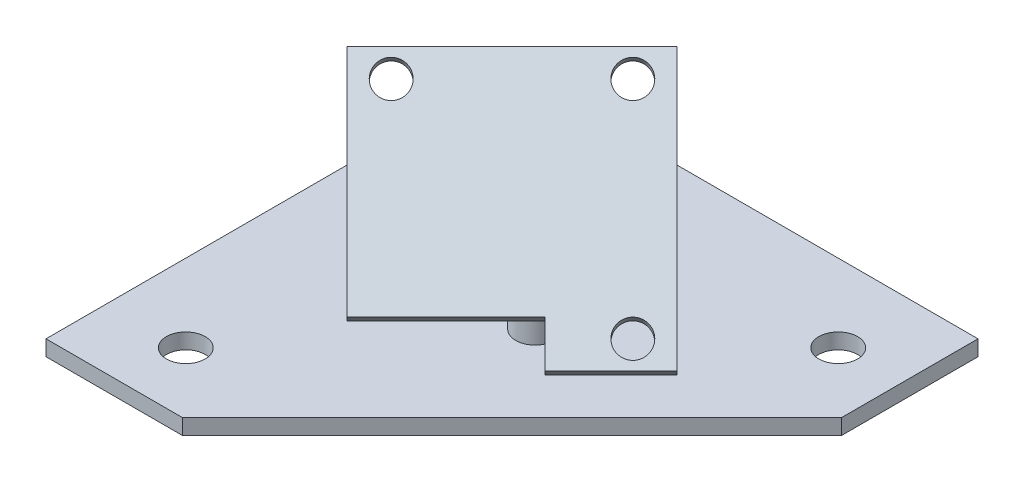
ISO-10303-21;
HEADER;
FILE_DESCRIPTION(('STEP AP214'),'2;1');
FILE_NAME('part.step','',(''),(''),'','','');
FILE_SCHEMA(('AUTOMOTIVE_DESIGN { 1 0 10303 214 1 1 1 1 }'));
ENDSEC;
DATA;
#1=APPLICATION_CONTEXT('core data for automotive mechanical design processes');
#2=APPLICATION_PROTOCOL_DEFINITION('international standard','automotive_design',2000,#1);
#3=PRODUCT_CONTEXT('',#1,'mechanical');
#4=PRODUCT('Part','Part','',(#3));
#5=PRODUCT_RELATED_PRODUCT_CATEGORY('part','',(#4));
#6=PRODUCT_DEFINITION_FORMATION('','',#4);
#7=PRODUCT_DEFINITION_CONTEXT('part definition',#1,'design');
#8=PRODUCT_DEFINITION('design','',#6,#7);
#9=PRODUCT_DEFINITION_SHAPE('','',#8);
#10=(LENGTH_UNIT() NAMED_UNIT(*) SI_UNIT(.MILLI.,.METRE.));
#11=(NAMED_UNIT(*) PLANE_ANGLE_UNIT() SI_UNIT($,.RADIAN.));
#12=(NAMED_UNIT(*) SI_UNIT($,.STERADIAN.) SOLID_ANGLE_UNIT());
#13=UNCERTAINTY_MEASURE_WITH_UNIT(LENGTH_MEASURE(1.E-05),#10,'distance_accuracy_value','');
#14=(GEOMETRIC_REPRESENTATION_CONTEXT(3) GLOBAL_UNCERTAINTY_ASSIGNED_CONTEXT((#13)) GLOBAL_UNIT_ASSIGNED_CONTEXT((#10,
#11,#12)) REPRESENTATION_CONTEXT('',''));
#15=CARTESIAN_POINT('',(0.,0.,0.));
#16=DIRECTION('',(0.,0.,1.));
#17=DIRECTION('',(1.,0.,0.));
#18=AXIS2_PLACEMENT_3D('',#15,#16,#17);
#19=CARTESIAN_POINT('',(0.,2.,0.));
#20=DIRECTION('',(0.,0.,-1.));
#21=DIRECTION('',(-1.,0.,0.));
#22=AXIS2_PLACEMENT_3D('',#19,#20,#21);
#23=PLANE('',#22);
#24=DIRECTION('',(1.,0.,0.));
#25=VECTOR('',#24,1.);
#26=CARTESIAN_POINT('',(0.,0.,0.));
#27=LINE('',#26,#25);
#28=CARTESIAN_POINT('',(20.,0.,0.));
#29=VERTEX_POINT('',#28);
#30=CARTESIAN_POINT('',(60.,0.,0.));
#31=VERTEX_POINT('',#30);
#32=EDGE_CURVE('E135',#29,#31,#27,.T.);
#33=ORIENTED_EDGE('',*,*,#32,.F.);
#34=DIRECTION('',(0.,-1.,0.));
#35=VECTOR('',#34,1.);
#36=CARTESIAN_POINT('',(20.,2.,0.));
#37=LINE('',#36,#35);
#38=CARTESIAN_POINT('',(20.,2.,0.));
#39=VERTEX_POINT('',#38);
#40=EDGE_CURVE('E11',#39,#29,#37,.T.);
#41=ORIENTED_EDGE('',*,*,#40,.F.);
#42=DIRECTION('',(1.,0.,0.));
#43=VECTOR('',#42,1.);
#44=CARTESIAN_POINT('',(0.,2.,0.));
#45=LINE('',#44,#43);
#46=CARTESIAN_POINT('',(60.,2.,0.));
#47=VERTEX_POINT('',#46);
#48=EDGE_CURVE('E173',#39,#47,#45,.T.);
#49=ORIENTED_EDGE('',*,*,#48,.T.);
#50=DIRECTION('',(0.,-1.,0.));
#51=VECTOR('',#50,1.);
#52=CARTESIAN_POINT('',(60.,2.,0.));
#53=LINE('',#52,#51);
#54=EDGE_CURVE('E52',#47,#31,#53,.T.);
#55=ORIENTED_EDGE('',*,*,#54,.T.);
#56=EDGE_LOOP('',(#33,#41,#49,#55));
#57=FACE_BOUND('',#56,.T.);
#58=ADVANCED_FACE('F35',(#57),#23,.T.);
#59=CARTESIAN_POINT('',(20.,2.,0.));
#60=DIRECTION('',(1.,0.,0.));
#61=DIRECTION('',(0.,0.,-1.));
#62=AXIS2_PLACEMENT_3D('',#59,#60,#61);
#63=PLANE('',#62);
#64=DIRECTION('',(0.,0.,1.));
#65=VECTOR('',#64,1.);
#66=CARTESIAN_POINT('',(20.,0.,0.));
#67=LINE('',#66,#65);
#68=CARTESIAN_POINT('',(20.,0.,20.));
#69=VERTEX_POINT('',#68);
#70=EDGE_CURVE('E137',#29,#69,#67,.T.);
#71=ORIENTED_EDGE('',*,*,#70,.T.);
#72=DIRECTION('',(0.,-1.,0.));
#73=VECTOR('',#72,1.);
#74=CARTESIAN_POINT('',(20.,2.,20.));
#75=LINE('',#74,#73);
#76=CARTESIAN_POINT('',(20.,2.,20.));
#77=VERTEX_POINT('',#76);
#78=EDGE_CURVE('E44',#77,#69,#75,.T.);
#79=ORIENTED_EDGE('',*,*,#78,.F.);
#80=DIRECTION('',(0.,0.,1.));
#81=VECTOR('',#80,1.);
#82=CARTESIAN_POINT('',(20.,2.,0.));
#83=LINE('',#82,#81);
#84=EDGE_CURVE('E171',#39,#77,#83,.T.);
#85=ORIENTED_EDGE('',*,*,#84,.F.);
#86=ORIENTED_EDGE('',*,*,#40,.T.);
#87=EDGE_LOOP('',(#71,#79,#85,#86));
#88=FACE_BOUND('',#87,.T.);
#89=ADVANCED_FACE('F165',(#88),#63,.F.);
#90=CARTESIAN_POINT('',(0.,2.,20.));
#91=DIRECTION('',(0.,0.,-1.));
#92=DIRECTION('',(-1.,0.,0.));
#93=AXIS2_PLACEMENT_3D('',#90,#91,#92);
#94=PLANE('',#93);
#95=DIRECTION('',(1.,0.,0.));
#96=VECTOR('',#95,1.);
#97=CARTESIAN_POINT('',(0.,0.,20.));
#98=LINE('',#97,#96);
#99=CARTESIAN_POINT('',(0.,0.,20.));
#100=VERTEX_POINT('',#99);
#101=EDGE_CURVE('E140',#100,#69,#98,.T.);
#102=ORIENTED_EDGE('',*,*,#101,.F.);
#103=DIRECTION('',(0.,-1.,0.));
#104=VECTOR('',#103,1.);
#105=CARTESIAN_POINT('',(0.,2.,20.));
#106=LINE('',#105,#104);
#107=CARTESIAN_POINT('',(0.,2.,20.));
#108=VERTEX_POINT('',#107);
#109=EDGE_CURVE('E156',#108,#100,#106,.T.);
#110=ORIENTED_EDGE('',*,*,#109,.F.);
#111=DIRECTION('',(1.,0.,0.));
#112=VECTOR('',#111,1.);
#113=CARTESIAN_POINT('',(0.,2.,20.));
#114=LINE('',#113,#112);
#115=EDGE_CURVE('E162',#108,#77,#114,.T.);
#116=ORIENTED_EDGE('',*,*,#115,.T.);
#117=ORIENTED_EDGE('',*,*,#78,.T.);
#118=EDGE_LOOP('',(#102,#110,#116,#117));
#119=FACE_BOUND('',#118,.T.);
#120=ADVANCED_FACE('F161',(#119),#94,.T.);
#121=CARTESIAN_POINT('',(0.,2.,0.));
#122=DIRECTION('',(1.,0.,0.));
#123=DIRECTION('',(0.,0.,-1.));
#124=AXIS2_PLACEMENT_3D('',#121,#122,#123);
#125=PLANE('',#124);
#126=DIRECTION('',(0.,0.,1.));
#127=VECTOR('',#126,1.);
#128=CARTESIAN_POINT('',(0.,0.,0.));
#129=LINE('',#128,#127);
#130=CARTESIAN_POINT('',(0.,0.,60.));
#131=VERTEX_POINT('',#130);
#132=EDGE_CURVE('E143',#100,#131,#129,.T.);
#133=ORIENTED_EDGE('',*,*,#132,.T.);
#134=DIRECTION('',(0.,-1.,0.));
#135=VECTOR('',#134,1.);
#136=CARTESIAN_POINT('',(0.,2.,60.));
#137=LINE('',#136,#135);
#138=CARTESIAN_POINT('',(0.,2.,60.));
#139=VERTEX_POINT('',#138);
#140=EDGE_CURVE('E120',#139,#131,#137,.T.);
#141=ORIENTED_EDGE('',*,*,#140,.F.);
#142=DIRECTION('',(0.,0.,1.));
#143=VECTOR('',#142,1.);
#144=CARTESIAN_POINT('',(0.,2.,0.));
#145=LINE('',#144,#143);
#146=EDGE_CURVE('E109',#108,#139,#145,.T.);
#147=ORIENTED_EDGE('',*,*,#146,.F.);
#148=ORIENTED_EDGE('',*,*,#109,.T.);
#149=EDGE_LOOP('',(#133,#141,#147,#148));
#150=FACE_BOUND('',#149,.T.);
#151=ADVANCED_FACE('F170',(#150),#125,.F.);
#152=CARTESIAN_POINT('',(0.,2.,60.));
#153=DIRECTION('',(0.,0.,-1.));
#154=DIRECTION('',(-1.,0.,0.));
#155=AXIS2_PLACEMENT_3D('',#152,#153,#154);
#156=PLANE('',#155);
#157=DIRECTION('',(1.,0.,0.));
#158=VECTOR('',#157,1.);
#159=CARTESIAN_POINT('',(0.,0.,60.));
#160=LINE('',#159,#158);
#161=CARTESIAN_POINT('',(17.5735931288071,0.,60.));
#162=VERTEX_POINT('',#161);
#163=EDGE_CURVE('E117',#131,#162,#160,.T.);
#164=ORIENTED_EDGE('',*,*,#163,.T.);
#165=DIRECTION('',(0.,-1.,0.));
#166=VECTOR('',#165,1.);
#167=CARTESIAN_POINT('',(17.5735931288071,2.,60.));
#168=LINE('',#167,#166);
#169=CARTESIAN_POINT('',(17.5735931288071,2.,60.));
#170=VERTEX_POINT('',#169);
#171=EDGE_CURVE('E115',#170,#162,#168,.T.);
#172=ORIENTED_EDGE('',*,*,#171,.F.);
#173=DIRECTION('',(1.,0.,0.));
#174=VECTOR('',#173,1.);
#175=CARTESIAN_POINT('',(0.,2.,60.));
#176=LINE('',#175,#174);
#177=EDGE_CURVE('E100',#139,#170,#176,.T.);
#178=ORIENTED_EDGE('',*,*,#177,.F.);
#179=ORIENTED_EDGE('',*,*,#140,.T.);
#180=EDGE_LOOP('',(#164,#172,#178,#179));
#181=FACE_BOUND('',#180,.T.);
#182=ADVANCED_FACE('F116',(#181),#156,.F.);
#183=CARTESIAN_POINT('',(38.7867965644036,2.,38.7867965644036));
#184=DIRECTION('',(0.707106781186547,0.,0.707106781186547));
#185=DIRECTION('',(0.707106781186548,0.,-0.707106781186548));
#186=AXIS2_PLACEMENT_3D('',#183,#184,#185);
#187=PLANE('',#186);
#188=DIRECTION('',(-0.707106781186548,0.,0.707106781186548));
#189=VECTOR('',#188,1.);
#190=CARTESIAN_POINT('',(38.7867965644036,0.,38.7867965644036));
#191=LINE('',#190,#189);
#192=CARTESIAN_POINT('',(60.,0.,17.5735931288071));
#193=VERTEX_POINT('',#192);
#194=EDGE_CURVE('E147',#193,#162,#191,.T.);
#195=ORIENTED_EDGE('',*,*,#194,.F.);
#196=DIRECTION('',(0.,-1.,0.));
#197=VECTOR('',#196,1.);
#198=CARTESIAN_POINT('',(60.,2.,17.5735931288071));
#199=LINE('',#198,#197);
#200=CARTESIAN_POINT('',(60.,2.,17.5735931288071));
#201=VERTEX_POINT('',#200);
#202=EDGE_CURVE('E75',#201,#193,#199,.T.);
#203=ORIENTED_EDGE('',*,*,#202,.F.);
#204=DIRECTION('',(-0.707106781186548,0.,0.707106781186548));
#205=VECTOR('',#204,1.);
#206=CARTESIAN_POINT('',(38.7867965644036,2.,38.7867965644036));
#207=LINE('',#206,#205);
#208=EDGE_CURVE('E106',#201,#170,#207,.T.);
#209=ORIENTED_EDGE('',*,*,#208,.T.);
#210=ORIENTED_EDGE('',*,*,#171,.T.);
#211=EDGE_LOOP('',(#195,#203,#209,#210));
#212=FACE_BOUND('',#211,.T.);
#213=ADVANCED_FACE('F122',(#212),#187,.T.);
#214=CARTESIAN_POINT('',(10.,2.,52.));
#215=DIRECTION('',(0.,-1.,0.));
#216=DIRECTION('',(0.,0.,-1.));
#217=AXIS2_PLACEMENT_3D('',#214,#215,#216);
#218=CYLINDRICAL_SURFACE('',#217,2.5);
#219=CARTESIAN_POINT('',(10.,2.,52.));
#220=DIRECTION('',(0.,1.,0.));
#221=DIRECTION('',(0.,0.,1.));
#222=AXIS2_PLACEMENT_3D('',#219,#220,#221);
#223=CIRCLE('',#222,2.5);
#224=CARTESIAN_POINT('',(10.,2.,54.5));
#225=VERTEX_POINT('',#224);
#226=EDGE_CURVE('E177',#225,#225,#223,.T.);
#227=ORIENTED_EDGE('',*,*,#226,.T.);
#228=EDGE_LOOP('',(#227));
#229=FACE_BOUND('',#228,.T.);
#230=CARTESIAN_POINT('',(10.,0.,52.));
#231=DIRECTION('',(0.,1.,0.));
#232=DIRECTION('',(0.,0.,1.));
#233=AXIS2_PLACEMENT_3D('',#230,#231,#232);
#234=CIRCLE('',#233,2.5);
#235=CARTESIAN_POINT('',(10.,0.,54.5));
#236=VERTEX_POINT('',#235);
#237=EDGE_CURVE('E131',#236,#236,#234,.T.);
#238=ORIENTED_EDGE('',*,*,#237,.F.);
#239=EDGE_LOOP('',(#238));
#240=FACE_BOUND('',#239,.T.);
#241=ADVANCED_FACE('F295',(#229,#240),#218,.F.);
#242=CARTESIAN_POINT('',(52.,2.,10.));
#243=DIRECTION('',(0.,-1.,0.));
#244=DIRECTION('',(0.,0.,-1.));
#245=AXIS2_PLACEMENT_3D('',#242,#243,#244);
#246=CYLINDRICAL_SURFACE('',#245,2.5);
#247=CARTESIAN_POINT('',(52.,2.,10.));
#248=DIRECTION('',(0.,1.,0.));
#249=DIRECTION('',(0.,0.,1.));
#250=AXIS2_PLACEMENT_3D('',#247,#248,#249);
#251=CIRCLE('',#250,2.5);
#252=CARTESIAN_POINT('',(52.,2.,12.5));
#253=VERTEX_POINT('',#252);
#254=EDGE_CURVE('E152',#253,#253,#251,.T.);
#255=ORIENTED_EDGE('',*,*,#254,.T.);
#256=EDGE_LOOP('',(#255));
#257=FACE_BOUND('',#256,.T.);
#258=CARTESIAN_POINT('',(52.,0.,10.));
#259=DIRECTION('',(0.,1.,0.));
#260=DIRECTION('',(0.,0.,1.));
#261=AXIS2_PLACEMENT_3D('',#258,#259,#260);
#262=CIRCLE('',#261,2.5);
#263=CARTESIAN_POINT('',(52.,0.,12.5));
#264=VERTEX_POINT('',#263);
#265=EDGE_CURVE('E128',#264,#264,#262,.T.);
#266=ORIENTED_EDGE('',*,*,#265,.F.);
#267=EDGE_LOOP('',(#266));
#268=FACE_BOUND('',#267,.T.);
#269=ADVANCED_FACE('F37',(#257,#268),#246,.F.);
#270=CARTESIAN_POINT('',(60.,2.,0.));
#271=DIRECTION('',(1.,0.,0.));
#272=DIRECTION('',(0.,0.,-1.));
#273=AXIS2_PLACEMENT_3D('',#270,#271,#272);
#274=PLANE('',#273);
#275=DIRECTION('',(0.,0.,1.));
#276=VECTOR('',#275,1.);
#277=CARTESIAN_POINT('',(60.,0.,0.));
#278=LINE('',#277,#276);
#279=EDGE_CURVE('E149',#31,#193,#278,.T.);
#280=ORIENTED_EDGE('',*,*,#279,.F.);
#281=ORIENTED_EDGE('',*,*,#54,.F.);
#282=DIRECTION('',(0.,0.,1.));
#283=VECTOR('',#282,1.);
#284=CARTESIAN_POINT('',(60.,2.,0.));
#285=LINE('',#284,#283);
#286=EDGE_CURVE('E123',#47,#201,#285,.T.);
#287=ORIENTED_EDGE('',*,*,#286,.T.);
#288=ORIENTED_EDGE('',*,*,#202,.T.);
#289=EDGE_LOOP('',(#280,#281,#287,#288));
#290=FACE_BOUND('',#289,.T.);
#291=ADVANCED_FACE('F302',(#290),#274,.T.);
#292=CARTESIAN_POINT('',(0.,2.,0.));
#293=DIRECTION('',(0.,1.,0.));
#294=DIRECTION('',(0.,0.,1.));
#295=AXIS2_PLACEMENT_3D('',#292,#293,#294);
#296=PLANE('',#295);
#297=CARTESIAN_POINT('',(30.4269297897974,2.,27.4459223568257));
#298=DIRECTION('',(0.,1.,0.));
#299=DIRECTION('',(0.,0.,1.));
#300=AXIS2_PLACEMENT_3D('',#297,#298,#299);
#301=CIRCLE('',#300,2.5);
#302=CARTESIAN_POINT('',(30.4269297897974,2.,29.9459223568258));
#303=VERTEX_POINT('',#302);
#304=EDGE_CURVE('E184',#303,#303,#301,.T.);
#305=ORIENTED_EDGE('',*,*,#304,.F.);
#306=EDGE_LOOP('',(#305));
#307=FACE_BOUND('',#306,.T.);
#308=ORIENTED_EDGE('',*,*,#254,.F.);
#309=EDGE_LOOP('',(#308));
#310=FACE_BOUND('',#309,.T.);
#311=ORIENTED_EDGE('',*,*,#226,.F.);
#312=EDGE_LOOP('',(#311));
#313=FACE_BOUND('',#312,.T.);
#314=ORIENTED_EDGE('',*,*,#48,.F.);
#315=ORIENTED_EDGE('',*,*,#84,.T.);
#316=ORIENTED_EDGE('',*,*,#115,.F.);
#317=ORIENTED_EDGE('',*,*,#146,.T.);
#318=ORIENTED_EDGE('',*,*,#177,.T.);
#319=ORIENTED_EDGE('',*,*,#208,.F.);
#320=ORIENTED_EDGE('',*,*,#286,.F.);
#321=EDGE_LOOP('',(#314,#315,#316,#317,#318,#319,#320));
#322=FACE_BOUND('',#321,.T.);
#323=ADVANCED_FACE('F103',(#307,#310,#313,#322),#296,.T.);
#324=CARTESIAN_POINT('',(0.,0.,0.));
#325=DIRECTION('',(0.,1.,0.));
#326=DIRECTION('',(0.,0.,1.));
#327=AXIS2_PLACEMENT_3D('',#324,#325,#326);
#328=PLANE('',#327);
#329=ORIENTED_EDGE('',*,*,#265,.T.);
#330=EDGE_LOOP('',(#329));
#331=FACE_BOUND('',#330,.T.);
#332=ORIENTED_EDGE('',*,*,#237,.T.);
#333=EDGE_LOOP('',(#332));
#334=FACE_BOUND('',#333,.T.);
#335=ORIENTED_EDGE('',*,*,#32,.T.);
#336=ORIENTED_EDGE('',*,*,#279,.T.);
#337=ORIENTED_EDGE('',*,*,#194,.T.);
#338=ORIENTED_EDGE('',*,*,#163,.F.);
#339=ORIENTED_EDGE('',*,*,#132,.F.);
#340=ORIENTED_EDGE('',*,*,#101,.T.);
#341=ORIENTED_EDGE('',*,*,#70,.F.);
#342=EDGE_LOOP('',(#335,#336,#337,#338,#339,#340,#341));
#343=FACE_BOUND('',#342,.T.);
#344=ADVANCED_FACE('F168',(#331,#334,#343),#328,.F.);
#345=CARTESIAN_POINT('',(30.4269297897974,24.4660614488348,27.4459223568257));
#346=DIRECTION('',(0.,-1.,0.));
#347=DIRECTION('',(0.,0.,-1.));
#348=AXIS2_PLACEMENT_3D('',#345,#346,#347);
#349=CYLINDRICAL_SURFACE('',#348,2.5);
#350=ORIENTED_EDGE('',*,*,#304,.T.);
#351=EDGE_LOOP('',(#350));
#352=FACE_BOUND('',#351,.T.);
#353=CARTESIAN_POINT('',(30.4269297897974,15.930527542902,27.4459223568257));
#354=DIRECTION('',(0.500000000000001,0.707106781186546,0.500000000000001));
#355=DIRECTION('',(0.499999999999999,-0.707106781186549,0.499999999999999));
#356=AXIS2_PLACEMENT_3D('',#353,#354,#355);
#357=ELLIPSE('',#356,3.53553390593275,2.5);
#358=CARTESIAN_POINT('',(32.1946967427638,13.430527542902,29.2136893097921));
#359=VERTEX_POINT('',#358);
#360=EDGE_CURVE('E132',#359,#359,#357,.T.);
#361=ORIENTED_EDGE('',*,*,#360,.F.);
#362=EDGE_LOOP('',(#361));
#363=FACE_BOUND('',#362,.T.);
#364=ADVANCED_FACE('F310',(#352,#363),#349,.T.);
#365=CARTESIAN_POINT('',(23.2218254069481,29.8406204335659,18.9791847198287));
#366=DIRECTION('',(-0.707106781186548,0.,0.707106781186547));
#367=DIRECTION('',(0.707106781186547,0.,0.707106781186548));
#368=AXIS2_PLACEMENT_3D('',#365,#366,#367);
#369=PLANE('',#368);
#370=DIRECTION('',(-0.499999999999999,0.707106781186549,-0.5));
#371=VECTOR('',#370,1.);
#372=CARTESIAN_POINT('',(22.2218254069481,28.4264068711928,17.9791847198287));
#373=LINE('',#372,#371);
#374=CARTESIAN_POINT('',(38.9374453749076,4.78695040902984,34.6948046877883));
#375=VERTEX_POINT('',#374);
#376=CARTESIAN_POINT('',(36.4374453749076,8.32248431496259,32.1948046877883));
#377=VERTEX_POINT('',#376);
#378=EDGE_CURVE('E228',#375,#377,#373,.T.);
#379=ORIENTED_EDGE('',*,*,#378,.F.);
#380=DIRECTION('',(-0.500000000000001,-0.707106781186546,-0.500000000000001));
#381=VECTOR('',#380,1.);
#382=CARTESIAN_POINT('',(39.9374453749076,6.20116397140293,35.6948046877883));
#383=LINE('',#382,#381);
#384=CARTESIAN_POINT('',(39.9374453749076,6.20116397140293,35.6948046877883));
#385=VERTEX_POINT('',#384);
#386=EDGE_CURVE('E187',#385,#375,#383,.T.);
#387=ORIENTED_EDGE('',*,*,#386,.F.);
#388=DIRECTION('',(-0.499999999999999,0.707106781186549,-0.5));
#389=VECTOR('',#388,1.);
#390=CARTESIAN_POINT('',(23.2218254069481,29.8406204335659,18.9791847198287));
#391=LINE('',#390,#389);
#392=CARTESIAN_POINT('',(37.4374453749076,9.73669787733568,33.1948046877883));
#393=VERTEX_POINT('',#392);
#394=EDGE_CURVE('E254',#385,#393,#391,.T.);
#395=ORIENTED_EDGE('',*,*,#394,.T.);
#396=DIRECTION('',(-0.500000000000001,-0.707106781186546,-0.500000000000001));
#397=VECTOR('',#396,1.);
#398=CARTESIAN_POINT('',(37.4374453749076,9.73669787733568,33.1948046877883));
#399=LINE('',#398,#397);
#400=EDGE_CURVE('E202',#393,#377,#399,.T.);
#401=ORIENTED_EDGE('',*,*,#400,.T.);
#402=EDGE_LOOP('',(#379,#387,#395,#401));
#403=FACE_BOUND('',#402,.T.);
#404=ADVANCED_FACE('F317',(#403),#369,.T.);
#405=CARTESIAN_POINT('',(37.8161250313479,6.20116397140293,37.816125031348));
#406=DIRECTION('',(0.499999999999999,-0.707106781186549,0.499999999999999));
#407=DIRECTION('',(0.,-0.577350269189625,-0.816496580927727));
#408=AXIS2_PLACEMENT_3D('',#405,#406,#407);
#409=PLANE('',#408);
#410=DIRECTION('',(-0.707106781186548,0.,0.707106781186547));
#411=VECTOR('',#410,1.);
#412=CARTESIAN_POINT('',(36.8161250313479,4.78695040902984,36.816125031348));
#413=LINE('',#412,#411);
#414=CARTESIAN_POINT('',(47.4227267491462,4.78695040902984,26.2095233135497));
#415=VERTEX_POINT('',#414);
#416=EDGE_CURVE('E225',#415,#375,#413,.T.);
#417=ORIENTED_EDGE('',*,*,#416,.F.);
#418=DIRECTION('',(-0.500000000000001,-0.707106781186546,-0.500000000000001));
#419=VECTOR('',#418,1.);
#420=CARTESIAN_POINT('',(48.4227267491462,6.20116397140293,27.2095233135497));
#421=LINE('',#420,#419);
#422=CARTESIAN_POINT('',(48.4227267491462,6.20116397140293,27.2095233135497));
#423=VERTEX_POINT('',#422);
#424=EDGE_CURVE('E190',#423,#415,#421,.T.);
#425=ORIENTED_EDGE('',*,*,#424,.F.);
#426=DIRECTION('',(-0.707106781186548,0.,0.707106781186547));
#427=VECTOR('',#426,1.);
#428=CARTESIAN_POINT('',(37.8161250313479,6.20116397140293,37.816125031348));
#429=LINE('',#428,#427);
#430=EDGE_CURVE('E251',#423,#385,#429,.T.);
#431=ORIENTED_EDGE('',*,*,#430,.T.);
#432=ORIENTED_EDGE('',*,*,#386,.T.);
#433=EDGE_LOOP('',(#417,#425,#431,#432));
#434=FACE_BOUND('',#433,.T.);
#435=ADVANCED_FACE('F387',(#434),#409,.T.);
#436=CARTESIAN_POINT('',(31.7071067811866,29.8406204335659,10.4939033455902));
#437=DIRECTION('',(-0.707106781186547,0.,0.707106781186547));
#438=DIRECTION('',(0.707106781186548,0.,0.707106781186548));
#439=AXIS2_PLACEMENT_3D('',#436,#437,#438);
#440=PLANE('',#439);
#441=DIRECTION('',(-0.499999999999999,0.707106781186549,-0.499999999999999));
#442=VECTOR('',#441,1.);
#443=CARTESIAN_POINT('',(30.7071067811866,28.4264068711928,9.49390334559019));
#444=LINE('',#443,#442);
#445=CARTESIAN_POINT('',(32.4227267491462,26.0001538446263,11.2095233135498));
#446=VERTEX_POINT('',#445);
#447=EDGE_CURVE('E222',#415,#446,#444,.T.);
#448=ORIENTED_EDGE('',*,*,#447,.T.);
#449=DIRECTION('',(-0.500000000000001,-0.707106781186546,-0.500000000000001));
#450=VECTOR('',#449,1.);
#451=CARTESIAN_POINT('',(33.4227267491462,27.4143674069994,12.2095233135498));
#452=LINE('',#451,#450);
#453=CARTESIAN_POINT('',(33.4227267491462,27.4143674069994,12.2095233135498));
#454=VERTEX_POINT('',#453);
#455=EDGE_CURVE('E193',#454,#446,#452,.T.);
#456=ORIENTED_EDGE('',*,*,#455,.F.);
#457=DIRECTION('',(-0.499999999999999,0.707106781186549,-0.499999999999999));
#458=VECTOR('',#457,1.);
#459=CARTESIAN_POINT('',(31.7071067811866,29.8406204335659,10.4939033455902));
#460=LINE('',#459,#458);
#461=EDGE_CURVE('E248',#423,#454,#460,.T.);
#462=ORIENTED_EDGE('',*,*,#461,.F.);
#463=ORIENTED_EDGE('',*,*,#424,.T.);
#464=EDGE_LOOP('',(#448,#456,#462,#463));
#465=FACE_BOUND('',#464,.T.);
#466=ADVANCED_FACE('F397',(#465),#440,.F.);
#467=CARTESIAN_POINT('',(22.816125031348,27.4143674069994,22.816125031348));
#468=DIRECTION('',(0.499999999999999,-0.707106781186549,0.499999999999999));
#469=DIRECTION('',(0.,-0.577350269189625,-0.816496580927727));
#470=AXIS2_PLACEMENT_3D('',#467,#468,#469);
#471=PLANE('',#470);
#472=DIRECTION('',(-0.707106781186548,0.,0.707106781186547));
#473=VECTOR('',#472,1.);
#474=CARTESIAN_POINT('',(21.816125031348,26.0001538446263,21.816125031348));
#475=LINE('',#474,#473);
#476=CARTESIAN_POINT('',(11.2095233135498,26.0001538446263,32.4227267491462));
#477=VERTEX_POINT('',#476);
#478=EDGE_CURVE('E219',#446,#477,#475,.T.);
#479=ORIENTED_EDGE('',*,*,#478,.T.);
#480=DIRECTION('',(-0.500000000000001,-0.707106781186546,-0.500000000000001));
#481=VECTOR('',#480,1.);
#482=CARTESIAN_POINT('',(12.2095233135498,27.4143674069994,33.4227267491462));
#483=LINE('',#482,#481);
#484=CARTESIAN_POINT('',(12.2095233135498,27.4143674069994,33.4227267491462));
#485=VERTEX_POINT('',#484);
#486=EDGE_CURVE('E196',#485,#477,#483,.T.);
#487=ORIENTED_EDGE('',*,*,#486,.F.);
#488=DIRECTION('',(-0.707106781186548,0.,0.707106781186547));
#489=VECTOR('',#488,1.);
#490=CARTESIAN_POINT('',(22.816125031348,27.4143674069994,22.816125031348));
#491=LINE('',#490,#489);
#492=EDGE_CURVE('E245',#454,#485,#491,.T.);
#493=ORIENTED_EDGE('',*,*,#492,.F.);
#494=ORIENTED_EDGE('',*,*,#455,.T.);
#495=EDGE_LOOP('',(#479,#487,#493,#494));
#496=FACE_BOUND('',#495,.T.);
#497=ADVANCED_FACE('F407',(#496),#471,.F.);
#498=CARTESIAN_POINT('',(10.4939033455902,29.8406204335659,31.7071067811866));
#499=DIRECTION('',(-0.707106781186547,0.,0.707106781186547));
#500=DIRECTION('',(0.707106781186548,0.,0.707106781186548));
#501=AXIS2_PLACEMENT_3D('',#498,#499,#500);
#502=PLANE('',#501);
#503=DIRECTION('',(-0.499999999999999,0.707106781186549,-0.499999999999999));
#504=VECTOR('',#503,1.);
#505=CARTESIAN_POINT('',(9.49390334559018,28.4264068711928,30.7071067811866));
#506=LINE('',#505,#504);
#507=CARTESIAN_POINT('',(23.7095233135498,8.32248431496257,44.9227267491462));
#508=VERTEX_POINT('',#507);
#509=EDGE_CURVE('E216',#508,#477,#506,.T.);
#510=ORIENTED_EDGE('',*,*,#509,.F.);
#511=DIRECTION('',(-0.500000000000001,-0.707106781186546,-0.500000000000001));
#512=VECTOR('',#511,1.);
#513=CARTESIAN_POINT('',(24.7095233135498,9.73669787733567,45.9227267491462));
#514=LINE('',#513,#512);
#515=CARTESIAN_POINT('',(24.7095233135498,9.73669787733567,45.9227267491462));
#516=VERTEX_POINT('',#515);
#517=EDGE_CURVE('E199',#516,#508,#514,.T.);
#518=ORIENTED_EDGE('',*,*,#517,.F.);
#519=DIRECTION('',(-0.499999999999999,0.707106781186549,-0.499999999999999));
#520=VECTOR('',#519,1.);
#521=CARTESIAN_POINT('',(10.4939033455902,29.8406204335659,31.7071067811866));
#522=LINE('',#521,#520);
#523=EDGE_CURVE('E242',#516,#485,#522,.T.);
#524=ORIENTED_EDGE('',*,*,#523,.T.);
#525=ORIENTED_EDGE('',*,*,#486,.T.);
#526=EDGE_LOOP('',(#510,#518,#524,#525));
#527=FACE_BOUND('',#526,.T.);
#528=ADVANCED_FACE('F417',(#527),#502,.T.);
#529=CARTESIAN_POINT('',(16.537950438296,25.2930470634397,32.0942996244));
#530=DIRECTION('',(-0.500000000000001,-0.707106781186546,-0.500000000000001));
#531=DIRECTION('',(0.,0.577350269189627,-0.816496580927725));
#532=AXIS2_PLACEMENT_3D('',#529,#530,#531);
#533=CYLINDRICAL_SURFACE('',#532,2.);
#534=CARTESIAN_POINT('',(16.537950438296,25.2930470634397,32.0942996244));
#535=DIRECTION('',(0.500000000000001,0.707106781186546,0.500000000000001));
#536=DIRECTION('',(0.,-0.577350269189627,0.816496580927725));
#537=AXIS2_PLACEMENT_3D('',#534,#535,#536);
#538=CIRCLE('',#537,2.);
#539=CARTESIAN_POINT('',(16.537950438296,24.1383465250605,33.7272927862554));
#540=VERTEX_POINT('',#539);
#541=EDGE_CURVE('E236',#540,#540,#538,.T.);
#542=ORIENTED_EDGE('',*,*,#541,.T.);
#543=EDGE_LOOP('',(#542));
#544=FACE_BOUND('',#543,.T.);
#545=CARTESIAN_POINT('',(15.5379504382959,23.8788335010667,31.0942996244));
#546=DIRECTION('',(0.500000000000001,0.707106781186546,0.500000000000001));
#547=DIRECTION('',(0.,-0.577350269189627,0.816496580927725));
#548=AXIS2_PLACEMENT_3D('',#545,#546,#547);
#549=CIRCLE('',#548,2.);
#550=CARTESIAN_POINT('',(15.5379504382959,22.7241329626874,32.7272927862554));
#551=VERTEX_POINT('',#550);
#552=EDGE_CURVE('E210',#551,#551,#549,.T.);
#553=ORIENTED_EDGE('',*,*,#552,.F.);
#554=EDGE_LOOP('',(#553));
#555=FACE_BOUND('',#554,.T.);
#556=ADVANCED_FACE('F427',(#544,#555),#533,.F.);
#557=CARTESIAN_POINT('',(35.316125031348,9.73669787733568,35.3161250313479));
#558=DIRECTION('',(-0.5,0.707106781186549,-0.499999999999999));
#559=DIRECTION('',(-0.816496580927727,-0.577350269189625,0.));
#560=AXIS2_PLACEMENT_3D('',#557,#558,#559);
#561=PLANE('',#560);
#562=DIRECTION('',(0.707106781186547,0.,-0.707106781186548));
#563=VECTOR('',#562,1.);
#564=CARTESIAN_POINT('',(34.316125031348,8.32248431496258,34.3161250313479));
#565=LINE('',#564,#563);
#566=EDGE_CURVE('E213',#508,#377,#565,.T.);
#567=ORIENTED_EDGE('',*,*,#566,.T.);
#568=ORIENTED_EDGE('',*,*,#400,.F.);
#569=DIRECTION('',(0.707106781186547,0.,-0.707106781186548));
#570=VECTOR('',#569,1.);
#571=CARTESIAN_POINT('',(35.316125031348,9.73669787733568,35.3161250313479));
#572=LINE('',#571,#570);
#573=EDGE_CURVE('E239',#516,#393,#572,.T.);
#574=ORIENTED_EDGE('',*,*,#573,.F.);
#575=ORIENTED_EDGE('',*,*,#517,.T.);
#576=EDGE_LOOP('',(#567,#568,#574,#575));
#577=FACE_BOUND('',#576,.T.);
#578=ADVANCED_FACE('F437',(#577),#561,.F.);
#579=CARTESIAN_POINT('',(44.0942996244,8.32248431496257,28.5379504382959));
#580=DIRECTION('',(-0.500000000000001,-0.707106781186546,-0.500000000000001));
#581=DIRECTION('',(0.,0.577350269189627,-0.816496580927725));
#582=AXIS2_PLACEMENT_3D('',#579,#580,#581);
#583=CYLINDRICAL_SURFACE('',#582,2.);
#584=CARTESIAN_POINT('',(44.0942996244,8.32248431496257,28.5379504382959));
#585=DIRECTION('',(0.500000000000001,0.707106781186546,0.500000000000001));
#586=DIRECTION('',(0.,-0.577350269189627,0.816496580927725));
#587=AXIS2_PLACEMENT_3D('',#584,#585,#586);
#588=CIRCLE('',#587,2.);
#589=CARTESIAN_POINT('',(44.0942996244,7.16778377658332,30.1709436001514));
#590=VERTEX_POINT('',#589);
#591=EDGE_CURVE('E209',#590,#590,#588,.T.);
#592=ORIENTED_EDGE('',*,*,#591,.T.);
#593=EDGE_LOOP('',(#592));
#594=FACE_BOUND('',#593,.T.);
#595=CARTESIAN_POINT('',(43.0942996244,6.90827075258948,27.5379504382959));
#596=DIRECTION('',(0.500000000000001,0.707106781186546,0.500000000000001));
#597=DIRECTION('',(0.,-0.577350269189627,0.816496580927725));
#598=AXIS2_PLACEMENT_3D('',#595,#596,#597);
#599=CIRCLE('',#598,2.);
#600=CARTESIAN_POINT('',(43.0942996244,5.75357021421023,29.1709436001514));
#601=VERTEX_POINT('',#600);
#602=EDGE_CURVE('E231',#601,#601,#599,.T.);
#603=ORIENTED_EDGE('',*,*,#602,.F.);
#604=EDGE_LOOP('',(#603));
#605=FACE_BOUND('',#604,.T.);
#606=ADVANCED_FACE('F260',(#594,#605),#583,.F.);
#607=CARTESIAN_POINT('',(32.0942996244,25.2930470634397,16.537950438296));
#608=DIRECTION('',(-0.500000000000001,-0.707106781186546,-0.500000000000001));
#609=DIRECTION('',(0.,0.577350269189627,-0.816496580927725));
#610=AXIS2_PLACEMENT_3D('',#607,#608,#609);
#611=CYLINDRICAL_SURFACE('',#610,2.);
#612=CARTESIAN_POINT('',(32.0942996244,25.2930470634397,16.537950438296));
#613=DIRECTION('',(0.500000000000001,0.707106781186546,0.500000000000001));
#614=DIRECTION('',(0.,-0.577350269189627,0.816496580927725));
#615=AXIS2_PLACEMENT_3D('',#612,#613,#614);
#616=CIRCLE('',#615,2.);
#617=CARTESIAN_POINT('',(32.0942996244,24.1383465250605,18.1709436001514));
#618=VERTEX_POINT('',#617);
#619=EDGE_CURVE('E205',#618,#618,#616,.F.);
#620=ORIENTED_EDGE('',*,*,#619,.F.);
#621=EDGE_LOOP('',(#620));
#622=FACE_BOUND('',#621,.T.);
#623=CARTESIAN_POINT('',(31.0942996244,23.8788335010667,15.5379504382959));
#624=DIRECTION('',(0.500000000000001,0.707106781186546,0.500000000000001));
#625=DIRECTION('',(0.,-0.577350269189627,0.816496580927725));
#626=AXIS2_PLACEMENT_3D('',#623,#624,#625);
#627=CIRCLE('',#626,2.);
#628=CARTESIAN_POINT('',(31.0942996244,22.7241329626874,17.1709436001514));
#629=VERTEX_POINT('',#628);
#630=EDGE_CURVE('E206',#629,#629,#627,.F.);
#631=ORIENTED_EDGE('',*,*,#630,.T.);
#632=EDGE_LOOP('',(#631));
#633=FACE_BOUND('',#632,.T.);
#634=ADVANCED_FACE('F267',(#622,#633),#611,.F.);
#635=CARTESIAN_POINT('',(21.1005050633884,29.8406204335659,21.1005050633884));
#636=DIRECTION('',(0.500000000000001,0.707106781186546,0.500000000000001));
#637=DIRECTION('',(0.,-0.577350269189627,0.816496580927725));
#638=AXIS2_PLACEMENT_3D('',#635,#636,#637);
#639=PLANE('',#638);
#640=ORIENTED_EDGE('',*,*,#591,.F.);
#641=EDGE_LOOP('',(#640));
#642=FACE_BOUND('',#641,.T.);
#643=ORIENTED_EDGE('',*,*,#394,.F.);
#644=ORIENTED_EDGE('',*,*,#430,.F.);
#645=ORIENTED_EDGE('',*,*,#461,.T.);
#646=ORIENTED_EDGE('',*,*,#492,.T.);
#647=ORIENTED_EDGE('',*,*,#523,.F.);
#648=ORIENTED_EDGE('',*,*,#573,.T.);
#649=EDGE_LOOP('',(#643,#644,#645,#646,#647,#648));
#650=FACE_BOUND('',#649,.T.);
#651=ORIENTED_EDGE('',*,*,#541,.F.);
#652=EDGE_LOOP('',(#651));
#653=FACE_BOUND('',#652,.T.);
#654=ORIENTED_EDGE('',*,*,#619,.T.);
#655=EDGE_LOOP('',(#654));
#656=FACE_BOUND('',#655,.T.);
#657=ADVANCED_FACE('F263',(#642,#650,#653,#656),#639,.T.);
#658=CARTESIAN_POINT('',(20.1005050633884,28.4264068711928,20.1005050633884));
#659=DIRECTION('',(0.500000000000001,0.707106781186546,0.500000000000001));
#660=DIRECTION('',(0.,-0.577350269189627,0.816496580927725));
#661=AXIS2_PLACEMENT_3D('',#658,#659,#660);
#662=PLANE('',#661);
#663=ORIENTED_EDGE('',*,*,#360,.T.);
#664=EDGE_LOOP('',(#663));
#665=FACE_BOUND('',#664,.T.);
#666=ORIENTED_EDGE('',*,*,#602,.T.);
#667=EDGE_LOOP('',(#666));
#668=FACE_BOUND('',#667,.T.);
#669=ORIENTED_EDGE('',*,*,#378,.T.);
#670=ORIENTED_EDGE('',*,*,#566,.F.);
#671=ORIENTED_EDGE('',*,*,#509,.T.);
#672=ORIENTED_EDGE('',*,*,#478,.F.);
#673=ORIENTED_EDGE('',*,*,#447,.F.);
#674=ORIENTED_EDGE('',*,*,#416,.T.);
#675=EDGE_LOOP('',(#669,#670,#671,#672,#673,#674));
#676=FACE_BOUND('',#675,.T.);
#677=ORIENTED_EDGE('',*,*,#552,.T.);
#678=EDGE_LOOP('',(#677));
#679=FACE_BOUND('',#678,.T.);
#680=ORIENTED_EDGE('',*,*,#630,.F.);
#681=EDGE_LOOP('',(#680));
#682=FACE_BOUND('',#681,.T.);
#683=ADVANCED_FACE('F266',(#665,#668,#676,#679,#682),#662,.F.);
#684=CLOSED_SHELL('',(#58,#89,#120,#151,#182,#213,#241,#269,#291,#323,#344,#364,#404,#435,#466,
#497,#528,#556,#578,#606,#634,#657,#683));
#685=MANIFOLD_SOLID_BREP('B2',#684);
#686=ADVANCED_BREP_SHAPE_REPRESENTATION('',(#18,#685),#14);
#687=SHAPE_DEFINITION_REPRESENTATION(#9,#686);
ENDSEC;
END-ISO-10303-21;
